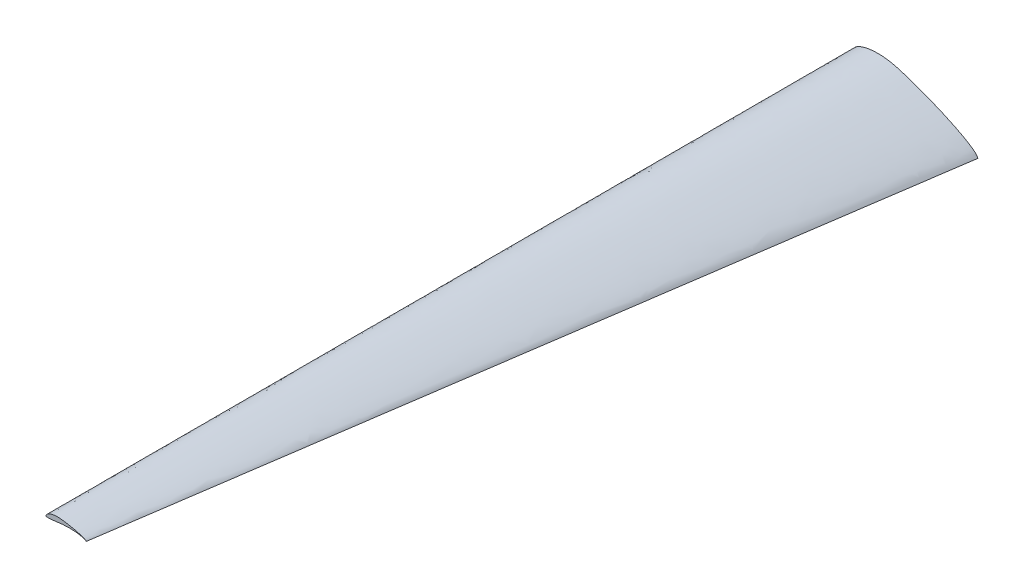
ISO-10303-21;
HEADER;
FILE_DESCRIPTION(('STEP AP214'),'2;1');
FILE_NAME('part.step','',(''),(''),'','','');
FILE_SCHEMA(('AUTOMOTIVE_DESIGN { 1 0 10303 214 1 1 1 1 }'));
ENDSEC;
DATA;
#1=APPLICATION_CONTEXT('core data for automotive mechanical design processes');
#2=APPLICATION_PROTOCOL_DEFINITION('international standard','automotive_design',2000,#1);
#3=PRODUCT_CONTEXT('',#1,'mechanical');
#4=PRODUCT('Part','Part','',(#3));
#5=PRODUCT_RELATED_PRODUCT_CATEGORY('part','',(#4));
#6=PRODUCT_DEFINITION_FORMATION('','',#4);
#7=PRODUCT_DEFINITION_CONTEXT('part definition',#1,'design');
#8=PRODUCT_DEFINITION('design','',#6,#7);
#9=PRODUCT_DEFINITION_SHAPE('','',#8);
#10=(LENGTH_UNIT() NAMED_UNIT(*) SI_UNIT(.MILLI.,.METRE.));
#11=(NAMED_UNIT(*) PLANE_ANGLE_UNIT() SI_UNIT($,.RADIAN.));
#12=(NAMED_UNIT(*) SI_UNIT($,.STERADIAN.) SOLID_ANGLE_UNIT());
#13=UNCERTAINTY_MEASURE_WITH_UNIT(LENGTH_MEASURE(1.E-05),#10,'distance_accuracy_value','');
#14=(GEOMETRIC_REPRESENTATION_CONTEXT(3) GLOBAL_UNCERTAINTY_ASSIGNED_CONTEXT((#13)) GLOBAL_UNIT_ASSIGNED_CONTEXT((#10,
#11,#12)) REPRESENTATION_CONTEXT('',''));
#15=CARTESIAN_POINT('',(0.,0.,0.));
#16=DIRECTION('',(0.,0.,1.));
#17=DIRECTION('',(1.,0.,0.));
#18=AXIS2_PLACEMENT_3D('',#15,#16,#17);
#19=CARTESIAN_POINT('',(0.177852621715534,0.538129016044614,500.));
#20=DIRECTION('',(0.,0.,-1.));
#21=DIRECTION('',(-1.,0.,0.));
#22=AXIS2_PLACEMENT_3D('',#19,#20,#21);
#23=PLANE('',#22);
#24=CARTESIAN_POINT('',(24.9657383688643,-1.3083989060736,500.));
#25=CARTESIAN_POINT('',(24.9659211372202,-1.30777118127219,500.));
#26=CARTESIAN_POINT('',(24.8870542598549,-1.24232109422479,500.));
#27=CARTESIAN_POINT('',(24.8212136304394,-1.17058048788677,500.));
#28=CARTESIAN_POINT('',(24.6745507578072,-1.02025700472763,500.));
#29=CARTESIAN_POINT('',(24.5006584165327,-0.859404979004517,500.));
#30=CARTESIAN_POINT('',(24.2599352106827,-0.693819703288479,500.));
#31=CARTESIAN_POINT('',(23.9584003357237,-0.529772184511535,500.));
#32=CARTESIAN_POINT('',(23.593109110757,-0.355916734630595,500.));
#33=CARTESIAN_POINT('',(23.1645180838336,-0.174431492549931,500.));
#34=CARTESIAN_POINT('',(22.6746068217033,0.0134564123888329,500.));
#35=CARTESIAN_POINT('',(22.1258890279423,0.206206849313119,500.));
#36=CARTESIAN_POINT('',(21.521445136275,0.402888673491008,500.));
#37=CARTESIAN_POINT('',(20.8645810585354,0.601813575142887,500.));
#38=CARTESIAN_POINT('',(20.1590498227737,0.801594057960295,500.));
#39=CARTESIAN_POINT('',(19.4090541376922,1.00099298738928,500.));
#40=CARTESIAN_POINT('',(18.6191819049756,1.19894691967824,500.));
#41=CARTESIAN_POINT('',(17.7939967063085,1.39329014310558,500.));
#42=CARTESIAN_POINT('',(16.9387333342498,1.58353243934119,500.));
#43=CARTESIAN_POINT('',(16.0582666727305,1.76754576650402,500.));
#44=CARTESIAN_POINT('',(15.1583513921923,1.94529775329526,500.));
#45=CARTESIAN_POINT('',(14.244744530525,2.11545183008815,500.));
#46=CARTESIAN_POINT('',(13.3240891838512,2.27726857695868,500.));
#47=CARTESIAN_POINT('',(12.4038347697921,2.43116170413698,500.));
#48=CARTESIAN_POINT('',(11.4915059957344,2.5740706667036,500.));
#49=CARTESIAN_POINT('',(10.594482933963,2.70382886476003,500.));
#50=CARTESIAN_POINT('',(9.71886150927105,2.81545935943417,500.));
#51=CARTESIAN_POINT('',(8.86947958557527,2.90519503304747,500.));
#52=CARTESIAN_POINT('',(8.05080533510073,2.96762866299189,500.));
#53=CARTESIAN_POINT('',(7.26725145264953,3.00661427614277,500.));
#54=CARTESIAN_POINT('',(6.5195069543389,3.00733677714258,500.));
#55=CARTESIAN_POINT('',(5.80712113746472,2.96672348744111,500.));
#56=CARTESIAN_POINT('',(5.12758750811802,2.8921169223932,500.));
#57=CARTESIAN_POINT('',(4.4807279124901,2.78322912011695,500.));
#58=CARTESIAN_POINT('',(3.86761306413132,2.64792193483418,500.));
#59=CARTESIAN_POINT('',(3.29095509584032,2.4890188338026,500.));
#60=CARTESIAN_POINT('',(2.75339559124329,2.31080405990054,500.));
#61=CARTESIAN_POINT('',(2.25826576945357,2.11420877745291,500.));
#62=CARTESIAN_POINT('',(1.80735233248289,1.90365763150733,500.));
#63=CARTESIAN_POINT('',(1.40318099666617,1.68168136248214,500.));
#64=CARTESIAN_POINT('',(1.0483788768604,1.45143729079899,500.));
#65=CARTESIAN_POINT('',(0.743362662237422,1.21817801107076,500.));
#66=CARTESIAN_POINT('',(0.492224520805339,0.978968370812016,500.));
#67=CARTESIAN_POINT('',(0.296210809495167,0.735928591518345,500.));
#68=CARTESIAN_POINT('',(0.148319907771107,0.497239973055056,500.));
#69=CARTESIAN_POINT('',(0.0495632708762007,0.268433195025406,500.));
#70=CARTESIAN_POINT('',(-0.00295447543302444,0.05521985454275,500.));
#71=CARTESIAN_POINT('',(-0.00454224338709244,-0.127352708842962,500.));
#72=CARTESIAN_POINT('',(0.0335988390782578,-0.296876376117312,500.));
#73=CARTESIAN_POINT('',(0.20357482435812,-0.388944967016245,500.));
#74=CARTESIAN_POINT('',(0.437343679026152,-0.412863433585569,500.));
#75=CARTESIAN_POINT('',(0.757381774317641,-0.440943776831186,500.));
#76=CARTESIAN_POINT('',(1.16150672197409,-0.444687890117561,500.));
#77=CARTESIAN_POINT('',(1.64442251613404,-0.437955891039795,500.));
#78=CARTESIAN_POINT('',(2.20101783680406,-0.415803813028377,500.));
#79=CARTESIAN_POINT('',(2.82556385718351,-0.37909400669089,500.));
#80=CARTESIAN_POINT('',(3.5151107017385,-0.326181799662972,500.));
#81=CARTESIAN_POINT('',(4.27014953231806,-0.241291326208084,500.));
#82=CARTESIAN_POINT('',(5.0941263116922,-0.128402818033724,500.));
#83=CARTESIAN_POINT('',(5.99018788371201,-0.00550803553789022,500.));
#84=CARTESIAN_POINT('',(6.95377320957862,0.123335526653627,500.));
#85=CARTESIAN_POINT('',(7.97849978123819,0.25101840908407,500.));
#86=CARTESIAN_POINT('',(9.05655581742164,0.371142786250566,500.));
#87=CARTESIAN_POINT('',(10.1793410504439,0.478261478263609,500.));
#88=CARTESIAN_POINT('',(11.3369359319311,0.56680628651204,500.));
#89=CARTESIAN_POINT('',(12.5187735927189,0.632986310006307,500.));
#90=CARTESIAN_POINT('',(13.7134526927182,0.671647448405974,500.));
#91=CARTESIAN_POINT('',(14.9088996464722,0.680785817423143,500.));
#92=CARTESIAN_POINT('',(16.0925158639482,0.658221558632512,500.));
#93=CARTESIAN_POINT('',(17.2513707297604,0.602473442589587,500.));
#94=CARTESIAN_POINT('',(18.3725206076361,0.513881116253294,500.));
#95=CARTESIAN_POINT('',(19.4431463161613,0.393814855834348,500.));
#96=CARTESIAN_POINT('',(20.4503766670958,0.243774431119053,500.));
#97=CARTESIAN_POINT('',(21.3823545713743,0.0681143188725926,500.));
#98=CARTESIAN_POINT('',(22.227052000337,-0.128855360923447,500.));
#99=CARTESIAN_POINT('',(22.9747389661672,-0.341510536716519,500.));
#100=CARTESIAN_POINT('',(23.6119193155118,-0.560524973609317,500.));
#101=CARTESIAN_POINT('',(24.1309711554189,-0.785838329034471,500.));
#102=CARTESIAN_POINT('',(24.4992133348935,-0.986434013196571,500.));
#103=CARTESIAN_POINT('',(24.76893316005,-1.16820266072511,500.));
#104=CARTESIAN_POINT('',(24.8725231548848,-1.23850287715182,500.));
#105=CARTESIAN_POINT('',(24.9655518848444,-1.30903939246347,500.));
#106=CARTESIAN_POINT('',(24.9657383688643,-1.3083989060736,500.));
#107=B_SPLINE_CURVE_WITH_KNOTS('',3,(#24,#25,#26,#27,#28,#29,#30,#31,#32,#33,#34,#35,#36,#37,
#38,#39,#40,#41,#42,#43,#44,#45,#46,#47,#48,#49,#50,#51,#52,#53,#54,#55,#56,#57,#58,#59,#60,#61,
#62,#63,#64,#65,#66,#67,#68,#69,#70,#71,#72,#73,#74,#75,#76,#77,#78,#79,#80,#81,#82,#83,#84,#85,
#86,#87,#88,#89,#90,#91,#92,#93,#94,#95,#96,#97,#98,#99,#100,#101,#102,#103,#104,#105,#106),
.UNSPECIFIED.,.T.,.F.,(4,1,1,1,1,1,1,1,1,1,1,1,1,1,1,1,1,1,1,1,1,1,1,1,1,1,1,1,1,1,1,1,1,1,1,1,
1,1,1,1,1,1,1,1,1,1,1,1,1,1,1,1,1,1,1,1,1,1,1,1,1,1,1,1,1,1,1,1,1,1,1,1,1,1,1,1,1,1,1,1,4),(0.,
0.000979677557134127,0.0036488621677631,0.00748349851947818,0.0120952771855934,
0.0175255907768788,0.0240517799938711,0.0317830505527586,0.0406778280832618,0.050710300790478,
0.0618332290621795,0.0739892504845854,0.0871181731906812,0.101145048769791,0.115990637111827,
0.13157042164059,0.147788379302961,0.164550916882416,0.181757895150531,0.199311954944345,
0.217095071712265,0.234990228463986,0.252856883122009,0.270540593729572,0.287886779266045,
0.304773437599674,0.321101419214061,0.336806063174811,0.351800032584037,0.366031063392082,
0.379615674919835,0.392652962879187,0.405170358707495,0.417171919049936,0.428603516911185,
0.43941895910826,0.449596586064162,0.459102079103161,0.467907877534646,0.475988300736528,
0.48330896874615,0.489874507816402,0.495803249719208,0.501149411695553,0.505903073256041,
0.510046768536664,0.513579310681042,0.516446926626751,0.519350052590901,0.523823355179486,
0.529973793997694,0.537715654387928,0.546967844488147,0.557637366825711,0.569620481096633,
0.582804124215616,0.597246960791633,0.613135036654701,0.630443600329816,0.649056123608546,
0.668822256795696,0.689594964002685,0.711189650864602,0.733426688964389,0.756094117504156,
0.778988553684862,0.801889682684955,0.824566597829707,0.846792284880412,0.868338290507787,
0.888978162959066,0.908492011340558,0.926658767581933,0.943286193042322,0.958169210358795,
0.971135821634751,0.981955623079976,0.990251791025976,0.995852565249962,0.999000405686701,1.),.UNSPECIFIED.);
#108=CARTESIAN_POINT('',(24.9657383688643,-1.3083989060736,500.));
#109=VERTEX_POINT('',#108);
#110=EDGE_CURVE('E11',#109,#109,#107,.T.);
#111=ORIENTED_EDGE('',*,*,#110,.T.);
#112=EDGE_LOOP('',(#111));
#113=FACE_BOUND('',#112,.T.);
#114=ADVANCED_FACE('F45',(#113),#23,.F.);
#115=CARTESIAN_POINT('',(0.8872474401851,1.58177980888547,0.));
#116=DIRECTION('',(0.,0.,-1.));
#117=DIRECTION('',(-1.,0.,0.));
#118=AXIS2_PLACEMENT_3D('',#115,#116,#117);
#119=PLANE('',#118);
#120=CARTESIAN_POINT('',(77.6236581020797,-19.3537516479734,0.));
#121=CARTESIAN_POINT('',(77.6246154970399,-19.3518914307497,0.));
#122=CARTESIAN_POINT('',(77.4168413999566,-19.0981439291712,0.));
#123=CARTESIAN_POINT('',(77.2538263644798,-18.8325902853563,0.));
#124=CARTESIAN_POINT('',(76.8849137571991,-18.2708424045065,0.));
#125=CARTESIAN_POINT('',(76.4368963627804,-17.6593961840115,0.));
#126=CARTESIAN_POINT('',(75.7818394589706,-16.992275669152,0.));
#127=CARTESIAN_POINT('',(74.9348215781215,-16.2928546439664,0.));
#128=CARTESIAN_POINT('',(73.8935204178983,-15.5236959647682,0.));
#129=CARTESIAN_POINT('',(72.6580401430418,-14.6919203798223,0.));
#130=CARTESIAN_POINT('',(71.2338497110435,-13.8025912576474,0.));
#131=CARTESIAN_POINT('',(69.6279047985015,-12.8620813073143,0.));
#132=CARTESIAN_POINT('',(67.8493131388238,-11.8751963254468,0.));
#133=CARTESIAN_POINT('',(65.9074284223442,-10.8492581952114,0.));
#134=CARTESIAN_POINT('',(63.813192497311,-9.79091688654471,0.));
#135=CARTESIAN_POINT('',(61.5790515611801,-8.70662462195275,0.));
#136=CARTESIAN_POINT('',(59.2187678359504,-7.60252321969453,0.));
#137=CARTESIAN_POINT('',(56.7453541170068,-6.48820210035888,0.));
#138=CARTESIAN_POINT('',(54.1749546494961,-5.36839744681885,0.));
#139=CARTESIAN_POINT('',(51.5215830943764,-4.25277042855736,0.));
#140=CARTESIAN_POINT('',(48.8032962970951,-3.14493646775866,0.));
#141=CARTESIAN_POINT('',(46.0373622108717,-2.05260918904444,0.));
#142=CARTESIAN_POINT('',(43.2441966941485,-0.982167463437832,0.));
#143=CARTESIAN_POINT('',(40.4474525164337,0.0631397276707607,0.));
#144=CARTESIAN_POINT('',(37.6688976067412,1.06910407725404,0.));
#145=CARTESIAN_POINT('',(34.9303913980974,2.02441365720142,0.));
#146=CARTESIAN_POINT('',(32.2480435889945,2.90971276903982,0.));
#147=CARTESIAN_POINT('',(29.6347507515633,3.71021417094443,0.));
#148=CARTESIAN_POINT('',(27.1012467501327,4.40620444162746,0.));
#149=CARTESIAN_POINT('',(24.6637459980348,5.00709553527926,0.));
#150=CARTESIAN_POINT('',(22.3153669064341,5.46592946533518,0.));
#151=CARTESIAN_POINT('',(20.0528175817841,5.77332950648099,0.));
#152=CARTESIAN_POINT('',(17.8727078654357,5.95389045632268,0.));
#153=CARTESIAN_POINT('',(15.7743023131048,6.00681654570254,0.));
#154=CARTESIAN_POINT('',(13.7657646176955,5.95614972034708,0.));
#155=CARTESIAN_POINT('',(11.8573381271477,5.80910307746313,0.));
#156=CARTESIAN_POINT('',(10.0599365130593,5.5775213893768,0.));
#157=CARTESIAN_POINT('',(8.38459238267852,5.26229563094,0.));
#158=CARTESIAN_POINT('',(6.83961977549295,4.87623358788055,0.));
#159=CARTESIAN_POINT('',(5.43449773101881,4.42574266561422,0.));
#160=CARTESIAN_POINT('',(4.17940638524131,3.91913657424063,0.));
#161=CARTESIAN_POINT('',(3.07886182046236,3.37266037492258,0.));
#162=CARTESIAN_POINT('',(2.14392621223064,2.77459551427193,0.));
#163=CARTESIAN_POINT('',(1.37980920911355,2.1308410353002,0.));
#164=CARTESIAN_POINT('',(0.769512681709647,1.47137120528474,0.));
#165=CARTESIAN_POINT('',(0.319590791235752,0.812941450410188,0.));
#166=CARTESIAN_POINT('',(0.0244360050312191,0.175260962478174,0.));
#167=CARTESIAN_POINT('',(-0.0920282624493205,-0.397267775963202,0.));
#168=CARTESIAN_POINT('',(-0.0757284777807108,-0.953065221281685,0.));
#169=CARTESIAN_POINT('',(0.40198522573562,-1.3460571526657,0.));
#170=CARTESIAN_POINT('',(1.1216972379229,-1.56392664796287,0.));
#171=CARTESIAN_POINT('',(2.10985759629863,-1.84754449018761,0.));
#172=CARTESIAN_POINT('',(3.37701159192801,-2.10605968586357,0.));
#173=CARTESIAN_POINT('',(4.89806054183052,-2.3797760514362,0.));
#174=CARTESIAN_POINT('',(6.65996746247156,-2.65004264990811,0.));
#175=CARTESIAN_POINT('',(8.64421038146753,-2.91607034563625,0.));
#176=CARTESIAN_POINT('',(10.8425273476816,-3.17089172137958,0.));
#177=CARTESIAN_POINT('',(13.2660937688413,-3.36525141537672,0.));
#178=CARTESIAN_POINT('',(15.9233038424337,-3.51375622549889,0.));
#179=CARTESIAN_POINT('',(18.8130568892258,-3.67484342278154,0.));
#180=CARTESIAN_POINT('',(21.91854828156,-3.85847351855359,0.));
#181=CARTESIAN_POINT('',(25.2153882843296,-4.08308170869547,0.));
#182=CARTESIAN_POINT('',(28.6751320351292,-4.36399510134325,0.));
#183=CARTESIAN_POINT('',(32.2674383260645,-4.71307318902718,0.));
#184=CARTESIAN_POINT('',(35.9577479228499,-5.14175007113851,0.));
#185=CARTESIAN_POINT('',(39.710553420605,-5.65548174054623,0.));
#186=CARTESIAN_POINT('',(43.4868938143146,-6.26349676285687,0.));
#187=CARTESIAN_POINT('',(47.2476199237104,-6.96471775751968,0.));
#188=CARTESIAN_POINT('',(50.951825972647,-7.75829955326755,0.));
#189=CARTESIAN_POINT('',(54.5579897996409,-8.64099970964061,0.));
#190=CARTESIAN_POINT('',(58.0256601486183,-9.60384808609039,0.));
#191=CARTESIAN_POINT('',(61.3154059926412,-10.6347131130029,0.));
#192=CARTESIAN_POINT('',(64.3877120078894,-11.7210246998545,0.));
#193=CARTESIAN_POINT('',(67.2079914180233,-12.8418647281973,0.));
#194=CARTESIAN_POINT('',(69.7410934063006,-13.9763500396223,0.));
#195=CARTESIAN_POINT('',(71.9598880620242,-15.1008732398319,0.));
#196=CARTESIAN_POINT('',(73.8276756684207,-16.1778980947233,0.));
#197=CARTESIAN_POINT('',(75.3205511265895,-17.2025812134438,0.));
#198=CARTESIAN_POINT('',(76.3547945585653,-18.057538323129,0.));
#199=CARTESIAN_POINT('',(77.0910544602052,-18.7931991691571,0.));
#200=CARTESIAN_POINT('',(77.3735275520195,-19.0772775892922,0.));
#201=CARTESIAN_POINT('',(77.6226812433665,-19.3556496832452,0.));
#202=CARTESIAN_POINT('',(77.6236581020797,-19.3537516479734,0.));
#203=B_SPLINE_CURVE_WITH_KNOTS('',3,(#120,#121,#122,#123,#124,#125,#126,#127,#128,#129,#130,
#131,#132,#133,#134,#135,#136,#137,#138,#139,#140,#141,#142,#143,#144,#145,#146,#147,#148,#149,
#150,#151,#152,#153,#154,#155,#156,#157,#158,#159,#160,#161,#162,#163,#164,#165,#166,#167,#168,
#169,#170,#171,#172,#173,#174,#175,#176,#177,#178,#179,#180,#181,#182,#183,#184,#185,#186,#187,
#188,#189,#190,#191,#192,#193,#194,#195,#196,#197,#198,#199,#200,#201,#202),.UNSPECIFIED.,.T.,
.F.,(4,1,1,1,1,1,1,1,1,1,1,1,1,1,1,1,1,1,1,1,1,1,1,1,1,1,1,1,1,1,1,1,1,1,1,1,1,1,1,1,1,1,1,1,1,
1,1,1,1,1,1,1,1,1,1,1,1,1,1,1,1,1,1,1,1,1,1,1,1,1,1,1,1,1,1,1,1,1,1,1,4),(0.,
0.000979677557134127,0.0036488621677631,0.00748349851947818,0.0120952771855934,
0.0175255907768788,0.0240517799938711,0.0317830505527586,0.0406778280832618,0.050710300790478,
0.0618332290621795,0.0739892504845854,0.0871181731906812,0.101145048769791,0.115990637111827,
0.13157042164059,0.147788379302961,0.164550916882416,0.181757895150531,0.199311954944345,
0.217095071712265,0.234990228463986,0.252856883122009,0.270540593729572,0.287886779266045,
0.304773437599674,0.321101419214061,0.336806063174811,0.351800032584037,0.366031063392082,
0.379615674919835,0.392652962879187,0.405170358707495,0.417171919049936,0.428603516911185,
0.43941895910826,0.449596586064162,0.459102079103161,0.467907877534646,0.475988300736528,
0.48330896874615,0.489874507816402,0.495803249719208,0.501149411695553,0.505903073256041,
0.510046768536664,0.513579310681042,0.516446926626751,0.519350052590901,0.523823355179486,
0.529973793997694,0.537715654387928,0.546967844488147,0.557637366825711,0.569620481096633,
0.582804124215616,0.597246960791633,0.613135036654701,0.630443600329816,0.649056123608546,
0.668822256795696,0.689594964002685,0.711189650864602,0.733426688964389,0.756094117504156,
0.778988553684862,0.801889682684955,0.824566597829707,0.846792284880412,0.868338290507787,
0.888978162959066,0.908492011340558,0.926658767581933,0.943286193042322,0.958169210358795,
0.971135821634751,0.981955623079976,0.990251791025976,0.995852565249962,0.999000405686701,1.),.UNSPECIFIED.);
#204=CARTESIAN_POINT('',(77.6236581020797,-19.3537516479734,0.));
#205=VERTEX_POINT('',#204);
#206=EDGE_CURVE('E55',#205,#205,#203,.T.);
#207=ORIENTED_EDGE('',*,*,#206,.F.);
#208=EDGE_LOOP('',(#207));
#209=FACE_BOUND('',#208,.T.);
#210=ADVANCED_FACE('F76',(#209),#119,.T.);
#211=CARTESIAN_POINT('',(77.589556155821,-19.3091196529313,0.));
#212=CARTESIAN_POINT('',(24.9657383688643,-1.3083989060736,500.));
#213=CARTESIAN_POINT('',(77.5700822295334,-19.2846832392953,0.));
#214=CARTESIAN_POINT('',(24.9658278573661,-1.3080915544441,500.));
#215=CARTESIAN_POINT('',(77.5190171521002,-19.2211268160083,0.));
#216=CARTESIAN_POINT('',(24.9555533379956,-1.29916714641745,500.));
#217=CARTESIAN_POINT('',(77.3846091906055,-19.0456372348263,0.));
#218=CARTESIAN_POINT('',(24.8927986638957,-1.24614233982107,500.));
#219=CARTESIAN_POINT('',(77.3127951712541,-18.9295108077496,0.));
#220=CARTESIAN_POINT('',(24.8593502299914,-1.21213450703603,500.));
#221=CARTESIAN_POINT('',(77.1486451596768,-18.6724295379673,0.));
#222=CARTESIAN_POINT('',(24.7977248743884,-1.14669501429866,500.));
#223=CARTESIAN_POINT('',(77.0050158543288,-18.4550317314914,0.));
#224=CARTESIAN_POINT('',(24.7419972447112,-1.08938691236068,500.));
#225=CARTESIAN_POINT('',(76.7449677697231,-18.0798465945634,0.));
#226=CARTESIAN_POINT('',(24.6392299627494,-0.987984004053063,500.));
#227=CARTESIAN_POINT('',(76.5780857590675,-17.8555743946599,0.));
#228=CARTESIAN_POINT('',(24.5749724818659,-0.928146177500931,500.));
#229=CARTESIAN_POINT('',(76.2347929691881,-17.4535708286814,0.));
#230=CARTESIAN_POINT('',(24.4475923709114,-0.82378011881693,500.));
#231=CARTESIAN_POINT('',(75.9994628759365,-17.2159625463552,0.));
#232=CARTESIAN_POINT('',(24.3620198353334,-0.76404023171435,500.));
#233=CARTESIAN_POINT('',(75.5267023459555,-16.7815973999176,0.));
#234=CARTESIAN_POINT('',(24.1918500709666,-0.657392540045339,500.));
#235=CARTESIAN_POINT('',(75.2239364802894,-16.5325551145107,0.));
#236=CARTESIAN_POINT('',(24.0844691955786,-0.598358889969904,500.));
#237=CARTESIAN_POINT('',(74.6188098296115,-16.0594320872846,0.));
#238=CARTESIAN_POINT('',(23.8710759135758,-0.488512402152182,500.));
#239=CARTESIAN_POINT('',(74.2482592871183,-15.7864747755374,0.));
#240=CARTESIAN_POINT('',(23.7413379730621,-0.426464269802667,500.));
#241=CARTESIAN_POINT('',(73.5120449226381,-15.2668711415233,0.));
#242=CARTESIAN_POINT('',(23.4848054159067,-0.310289934361858,500.));
#243=CARTESIAN_POINT('',(73.0763867230646,-14.9741422595119,0.));
#244=CARTESIAN_POINT('',(23.3338494331602,-0.246134209111657,500.));
#245=CARTESIAN_POINT('',(72.2127864724687,-14.4138837864712,0.));
#246=CARTESIAN_POINT('',(23.0357457946893,-0.125224121221604,500.));
#247=CARTESIAN_POINT('',(71.7134099682588,-14.1025161098544,0.));
#248=CARTESIAN_POINT('',(22.864096659906,-0.0592156232616122,500.));
#249=CARTESIAN_POINT('',(70.7260788097736,-13.5052189247583,0.));
#250=CARTESIAN_POINT('',(22.5257741708655,0.0655931045897536,500.));
#251=CARTESIAN_POINT('',(70.1655767818801,-13.1773402980061,0.));
#252=CARTESIAN_POINT('',(22.3343635888313,0.132975102218625,500.));
#253=CARTESIAN_POINT('',(69.0601033330909,-12.5470260017038,0.));
#254=CARTESIAN_POINT('',(21.9577928204244,0.260788292486256,500.));
#255=CARTESIAN_POINT('',(68.4416969360096,-12.2042197979758,0.));
#256=CARTESIAN_POINT('',(21.7477126587127,0.329262800719738,500.));
#257=CARTESIAN_POINT('',(67.2241440478957,-11.5449064772469,0.));
#258=CARTESIAN_POINT('',(21.3350095026435,0.459247984182048,500.));
#259=CARTESIAN_POINT('',(66.5508001105512,-11.189452153672,0.));
#260=CARTESIAN_POINT('',(21.1073116878138,0.528304963249755,500.));
#261=CARTESIAN_POINT('',(65.2278751537096,-10.5058397259556,0.));
#262=CARTESIAN_POINT('',(20.6608180076598,0.659423831528019,500.));
#263=CARTESIAN_POINT('',(64.503448771413,-10.1399974799462,0.));
#264=CARTESIAN_POINT('',(20.4168220722705,0.728602442775747,500.));
#265=CARTESIAN_POINT('',(63.0830812305583,-9.43657308216398,0.));
#266=CARTESIAN_POINT('',(19.9392414546585,0.859956587612188,500.));
#267=CARTESIAN_POINT('',(62.3117353789036,-9.06244085631929,0.));
#268=CARTESIAN_POINT('',(19.6803513035499,0.928864086510002,500.));
#269=CARTESIAN_POINT('',(60.802521625918,-8.34337685590932,0.));
#270=CARTESIAN_POINT('',(19.1745722884914,1.0596896885522,500.));
#271=CARTESIAN_POINT('',(59.9887553281592,-7.96293287437315,0.));
#272=CARTESIAN_POINT('',(18.9022888444138,1.12799603724585,500.));
#273=CARTESIAN_POINT('',(58.3997453784692,-7.23353762921627,0.));
#274=CARTESIAN_POINT('',(18.3714120847885,1.25723312577568,500.));
#275=CARTESIAN_POINT('',(57.5481463960776,-6.8500686457874,0.));
#276=CARTESIAN_POINT('',(18.0873391371353,1.32420369600622,500.));
#277=CARTESIAN_POINT('',(55.8891279216758,-6.11518378544961,0.));
#278=CARTESIAN_POINT('',(17.5346491820403,1.45092049310251,500.));
#279=CARTESIAN_POINT('',(55.0049388293339,-5.73018218593809,0.));
#280=CARTESIAN_POINT('',(17.2404845261556,1.51641178210807,500.));
#281=CARTESIAN_POINT('',(53.2859649853171,-4.99461606426063,0.));
#282=CARTESIAN_POINT('',(16.6693610498648,1.63977025821153,500.));
#283=CARTESIAN_POINT('',(52.3740275254217,-4.61135621103855,0.));
#284=CARTESIAN_POINT('',(16.3667855898221,1.70306678631329,500.));
#285=CARTESIAN_POINT('',(50.60554123536,-3.879438857383,0.));
#286=CARTESIAN_POINT('',(15.7806824397049,1.82232350629702,500.));
#287=CARTESIAN_POINT('',(49.6714858708863,-3.49893350865801,0.));
#288=CARTESIAN_POINT('',(15.471483389782,1.88344767040058,500.));
#289=CARTESIAN_POINT('',(47.8652134385131,-2.77446722873117,0.));
#290=CARTESIAN_POINT('',(14.8742309236843,1.99816361106158,500.));
#291=CARTESIAN_POINT('',(46.9151762719774,-2.39943316198269,0.));
#292=CARTESIAN_POINT('',(14.5604538070506,2.05665277467811,500.));
#293=CARTESIAN_POINT('',(45.0836253573936,-1.68710284253569,0.));
#294=CARTESIAN_POINT('',(13.9561663085089,2.16612670379312,500.));
#295=CARTESIAN_POINT('',(44.1240017751513,-1.31946804124708,0.));
#296=CARTESIAN_POINT('',(13.6398867653462,2.22176318344556,500.));
#297=CARTESIAN_POINT('',(42.2815987883333,-0.622388216872323,0.));
#298=CARTESIAN_POINT('',(13.0331727904033,2.32588052481589,500.));
#299=CARTESIAN_POINT('',(41.3204409041443,-0.263306120648175,0.));
#300=CARTESIAN_POINT('',(12.7169319073515,2.37880281634088,500.));
#301=CARTESIAN_POINT('',(39.4826871824706,0.412429039282064,0.));
#302=CARTESIAN_POINT('',(12.1129211922209,2.47668435525907,500.));
#303=CARTESIAN_POINT('',(38.5274744154996,0.758079132770716,0.));
#304=CARTESIAN_POINT('',(11.7993065674834,2.52585618346372,500.));
#305=CARTESIAN_POINT('',(36.7097391086283,1.40370010593675,0.));
#306=CARTESIAN_POINT('',(11.2032341713241,2.61571774443947,500.));
#307=CARTESIAN_POINT('',(35.7683053048772,1.73185306075719,0.));
#308=CARTESIAN_POINT('',(10.8948925751172,2.66037333348533,500.));
#309=CARTESIAN_POINT('',(33.9836173642404,2.33689297417919,0.));
#310=CARTESIAN_POINT('',(10.3113866075335,2.73984468866544,500.));
#311=CARTESIAN_POINT('',(33.0611256453055,2.64102625025643,0.));
#312=CARTESIAN_POINT('',(10.0102915067578,2.77830577471715,500.));
#313=CARTESIAN_POINT('',(31.3192395247581,3.19422315565488,0.));
#314=CARTESIAN_POINT('',(9.44301129547839,2.84450662962756,500.));
#315=CARTESIAN_POINT('',(30.4201611713599,3.46918075387322,0.));
#316=CARTESIAN_POINT('',(9.15083962538311,2.87546985054045,500.));
#317=CARTESIAN_POINT('',(28.7281624945705,3.95926710554654,0.));
#318=CARTESIAN_POINT('',(8.60262699036145,2.9254166530944,500.));
#319=CARTESIAN_POINT('',(27.8550561674932,4.19871835183458,0.));
#320=CARTESIAN_POINT('',(8.32053598016796,2.94705849937793,500.));
#321=CARTESIAN_POINT('',(26.2221204497428,4.62292608310582,0.));
#322=CARTESIAN_POINT('',(7.79435482104965,2.9802718714721,500.));
#323=CARTESIAN_POINT('',(25.3813889789047,4.8294390676992,0.));
#324=CARTESIAN_POINT('',(7.52415436386714,2.99383210794939,500.));
#325=CARTESIAN_POINT('',(23.8138033719563,5.17316008458498,0.));
#326=CARTESIAN_POINT('',(7.02281553455521,3.00663602138348,500.));
#327=CARTESIAN_POINT('',(23.0055733734502,5.33020182857374,0.));
#328=CARTESIAN_POINT('',(6.76551924826658,3.00709907010665,500.));
#329=CARTESIAN_POINT('',(21.4995212966823,5.57677388816125,0.));
#330=CARTESIAN_POINT('',(6.28879401903112,2.99392739302967,500.));
#331=CARTESIAN_POINT('',(20.719391935427,5.68198417699055,0.));
#332=CARTESIAN_POINT('',(6.0431818527675,2.98018136657155,500.));
#333=CARTESIAN_POINT('',(19.2682863781664,5.83830591488988,0.));
#334=CARTESIAN_POINT('',(5.58864731203293,2.94250305652022,500.));
#335=CARTESIAN_POINT('',(18.514196152596,5.89990870905007,0.));
#336=CARTESIAN_POINT('',(5.35359459809681,2.91693042967466,500.));
#337=CARTESIAN_POINT('',(17.1163297745341,5.97296786221286,0.));
#338=CARTESIAN_POINT('',(4.92029538628715,2.85696394710736,500.));
#339=CARTESIAN_POINT('',(16.3890010926711,5.99056439817075,0.));
#340=CARTESIAN_POINT('',(4.69605174108491,2.81947522148403,500.));
#341=CARTESIAN_POINT('',(15.047027562004,5.98847051073208,0.));
#342=CARTESIAN_POINT('',(4.28434890430247,2.739660709095,500.));
#343=CARTESIAN_POINT('',(14.348611385958,5.9700821192227,0.));
#344=CARTESIAN_POINT('',(4.07109921381524,2.69282891797357,500.));
#345=CARTESIAN_POINT('',(13.0691431888214,5.90247416984288,0.));
#346=CARTESIAN_POINT('',(3.68243044401712,2.59665501978845,500.));
#347=CARTESIAN_POINT('',(12.4043593019984,5.85048186306956,0.));
#348=CARTESIAN_POINT('',(3.48147791535963,2.54151904797396,500.));
#349=CARTESIAN_POINT('',(11.1959320050289,5.7238858699841,0.));
#350=CARTESIAN_POINT('',(3.11807833660232,2.43146610104092,500.));
#351=CARTESIAN_POINT('',(10.5688164248567,5.64220864374673,0.));
#352=CARTESIAN_POINT('',(2.93041698853555,2.36949119690487,500.));
#353=CARTESIAN_POINT('',(9.43835771326215,5.46056771696935,0.));
#354=CARTESIAN_POINT('',(2.59413403335397,2.24729167922318,500.));
#355=CARTESIAN_POINT('',(8.85200552669827,5.3493341692523,0.));
#356=CARTESIAN_POINT('',(2.42070024615626,2.1787046943241,500.));
#357=CARTESIAN_POINT('',(7.80553771574384,5.11759984363595,0.));
#358=CARTESIAN_POINT('',(2.11310864956784,2.04614022412178,500.));
#359=CARTESIAN_POINT('',(7.26320367941724,4.98105118366148,0.));
#360=CARTESIAN_POINT('',(1.95464151685317,1.97243337428159,500.));
#361=CARTESIAN_POINT('',(6.30691703062435,4.70544575363269,0.));
#362=CARTESIAN_POINT('',(1.67722687788265,1.83186012918482,500.));
#363=CARTESIAN_POINT('',(5.81185044490377,4.54553802986406,0.));
#364=CARTESIAN_POINT('',(1.53458439936734,1.75384985758306,500.));
#365=CARTESIAN_POINT('',(4.95200587598826,4.23098926091665,0.));
#366=CARTESIAN_POINT('',(1.2889378347387,1.60715678848077,500.));
#367=CARTESIAN_POINT('',(4.507610520153,4.0503164761989,0.));
#368=CARTESIAN_POINT('',(1.16300696961721,1.52582365247025,500.));
#369=CARTESIAN_POINT('',(3.74952078115646,3.70567656673151,0.));
#370=CARTESIAN_POINT('',(0.950260040184446,1.37597054365516,500.));
#371=CARTESIAN_POINT('',(3.35852101405583,3.50962355125342,0.));
#372=CARTESIAN_POINT('',(0.84147074511683,1.29320556583946,500.));
#373=CARTESIAN_POINT('',(2.70985652969522,3.13661299812045,0.));
#374=CARTESIAN_POINT('',(0.663561561399431,1.14150401424852,500.));
#375=CARTESIAN_POINT('',(2.37771149067899,2.92168865545646,0.));
#376=CARTESIAN_POINT('',(0.573703524204296,1.05657730341207,500.));
#377=CARTESIAN_POINT('',(1.84130488371006,2.51964262764229,0.));
#378=CARTESIAN_POINT('',(0.431509748919238,0.902750244692598,500.));
#379=CARTESIAN_POINT('',(1.56731358592033,2.28622553575821,0.));
#380=CARTESIAN_POINT('',(0.360442841790737,0.815570667821858,500.));
#381=CARTESIAN_POINT('',(1.13503129188789,1.86634067487538,0.));
#382=CARTESIAN_POINT('',(0.251191121011611,0.662203604978581,500.));
#383=CARTESIAN_POINT('',(0.914313099046398,1.62433846056879,0.));
#384=CARTESIAN_POINT('',(0.196793911873951,0.5754746239755,500.));
#385=CARTESIAN_POINT('',(0.584845094561315,1.20112288726829,0.));
#386=CARTESIAN_POINT('',(0.118782486099414,0.427118621589412,500.));
#387=CARTESIAN_POINT('',(0.421208645210169,0.956765378221853,0.));
#388=CARTESIAN_POINT('',(0.0817600710811223,0.343029154845221,500.));
#389=CARTESIAN_POINT('',(0.194839708448872,0.543417339469774,0.));
#390=CARTESIAN_POINT('',(0.0344103847202297,0.203761373243001,500.));
#391=CARTESIAN_POINT('',(0.0884139599372809,0.304279111835336,0.));
#392=CARTESIAN_POINT('',(0.0140834768501311,0.12439111524168,500.));
#393=CARTESIAN_POINT('',(-0.0268568716153943,-0.0768905908935214,0.));
#394=CARTESIAN_POINT('',(-0.00235764367140643,0.000742433756245641,500.));
#395=CARTESIAN_POINT('',(-0.0673673991195018,-0.297571188705904,0.));
#396=CARTESIAN_POINT('',(-0.00403512397764069,-0.0690406045527603,500.));
#397=CARTESIAN_POINT('',(-0.0849630617754419,-0.638180190761322,0.));
#398=CARTESIAN_POINT('',(0.0069587440799328,-0.173738936641277,500.));
#399=CARTESIAN_POINT('',(-0.0659672246611726,-0.833130465744622,0.));
#400=CARTESIAN_POINT('',(0.0196468939769272,-0.234864898038874,500.));
#401=CARTESIAN_POINT('',(0.0813146012542304,-1.08225695785142,0.));
#402=CARTESIAN_POINT('',(0.0682712288557247,-0.310938761724825,500.));
#403=CARTESIAN_POINT('',(0.241529815712007,-1.20767692061808,0.));
#404=CARTESIAN_POINT('',(0.121054486881066,-0.344247292933006,500.));
#405=CARTESIAN_POINT('',(0.583052325367023,-1.40086935107785,0.));
#406=CARTESIAN_POINT('',(0.236696618966852,-0.38987642730224,500.));
#407=CARTESIAN_POINT('',(0.847802585765041,-1.48081617129453,0.));
#408=CARTESIAN_POINT('',(0.322412008220681,-0.401103999978295,500.));
#409=CARTESIAN_POINT('',(1.38928555501604,-1.64072877876606,0.));
#410=CARTESIAN_POINT('',(0.497914396791287,-0.41809910140813,500.));
#411=CARTESIAN_POINT('',(1.74733824281935,-1.74240789325664,0.));
#412=CARTESIAN_POINT('',(0.613759510641124,-0.428342269319788,500.));
#413=CARTESIAN_POINT('',(2.47396716987198,-1.9218273776539,0.));
#414=CARTESIAN_POINT('',(0.847323751956326,-0.441371413791047,500.));
#415=CARTESIAN_POINT('',(2.92526337850042,-2.01357662738789,0.));
#416=CARTESIAN_POINT('',(0.991224143477032,-0.443110265998371,500.));
#417=CARTESIAN_POINT('',(3.83018057279798,-2.18760851862265,0.));
#418=CARTESIAN_POINT('',(1.27919641437601,-0.442930999699282,500.));
#419=CARTESIAN_POINT('',(4.36645199947935,-2.2837528558526,0.));
#420=CARTESIAN_POINT('',(1.44943907028723,-0.440674022013133,500.));
#421=CARTESIAN_POINT('',(5.43661388994758,-2.46238710187597,0.));
#422=CARTESIAN_POINT('',(1.78838285804377,-0.432099829995405,500.));
#423=CARTESIAN_POINT('',(6.0534737145527,-2.55674613360267,0.));
#424=CARTESIAN_POINT('',(1.98324379718609,-0.424471057137925,500.));
#425=CARTESIAN_POINT('',(7.2784202090608,-2.73295868680904,0.));
#426=CARTESIAN_POINT('',(2.36953104881239,-0.405807649436316,500.));
#427=CARTESIAN_POINT('',(7.96963833146506,-2.82538051497765,0.));
#428=CARTESIAN_POINT('',(2.58708863249649,-0.393111195222858,500.));
#429=CARTESIAN_POINT('',(9.33701833947481,-2.996378271972,0.));
#430=CARTESIAN_POINT('',(3.01675908333615,-0.364337612670759,500.));
#431=CARTESIAN_POINT('',(10.0965037006422,-3.08392250814434,0.));
#432=CARTESIAN_POINT('',(3.25497711327372,-0.346143086407235,500.));
#433=CARTESIAN_POINT('',(11.6046451627233,-3.23201032082378,0.));
#434=CARTESIAN_POINT('',(3.72649860849752,-0.30224698515548,500.));
#435=CARTESIAN_POINT('',(12.43691461659,-3.29842079521744,0.));
#436=CARTESIAN_POINT('',(3.98579333280497,-0.273262042718081,500.));
#437=CARTESIAN_POINT('',(14.0995675838537,-3.41183217760938,0.));
#438=CARTESIAN_POINT('',(4.50264313122834,-0.209323476761318,500.));
#439=CARTESIAN_POINT('',(15.0136530579474,-3.46291615166777,0.));
#440=CARTESIAN_POINT('',(4.78610774921584,-0.170602740262575,500.));
#441=CARTESIAN_POINT('',(16.8373794539254,-3.56471071052766,0.));
#442=CARTESIAN_POINT('',(5.35162175590152,-0.0930866609063811,500.));
#443=CARTESIAN_POINT('',(17.8306829059664,-3.6201285081624,0.));
#444=CARTESIAN_POINT('',(5.6596286402997,-0.0508442128605865,500.));
#445=CARTESIAN_POINT('',(19.8061813635887,-3.73356763718155,0.));
#446=CARTESIAN_POINT('',(6.27238571283232,0.0322095728438522,500.));
#447=CARTESIAN_POINT('',(20.8720156108374,-3.79671610578511,0.));
#448=CARTESIAN_POINT('',(6.6030976235007,0.0764457593740747,500.));
#449=CARTESIAN_POINT('',(22.9837972871071,-3.9310471499659,0.));
#450=CARTESIAN_POINT('',(7.25889444634436,0.161312590185981,500.));
#451=CARTESIAN_POINT('',(24.1133301843163,-4.00818219972386,0.));
#452=CARTESIAN_POINT('',(7.60997559207415,0.205099593256351,500.));
#453=CARTESIAN_POINT('',(26.3438551648553,-4.17470741358355,0.));
#454=CARTESIAN_POINT('',(8.30411111256388,0.287240365798184,500.));
#455=CARTESIAN_POINT('',(27.5283509792454,-4.27110543898796,0.));
#456=CARTESIAN_POINT('',(8.67319901150984,0.328426548877859,500.));
#457=CARTESIAN_POINT('',(29.857993293907,-4.47893823613426,0.));
#458=CARTESIAN_POINT('',(9.40020078465636,0.403855552067853,500.));
#459=CARTESIAN_POINT('',(31.0865325717725,-4.59858567251958,0.));
#460=CARTESIAN_POINT('',(9.78418533473855,0.440561870036759,500.));
#461=CARTESIAN_POINT('',(33.4935627307367,-4.8555032949818,0.));
#462=CARTESIAN_POINT('',(10.5378537619048,0.505598973836518,500.));
#463=CARTESIAN_POINT('',(34.7552978596478,-5.00236054264737,0.));
#464=CARTESIAN_POINT('',(10.9336451335778,0.535958442434959,500.));
#465=CARTESIAN_POINT('',(37.2162886671452,-5.31403510908444,0.));
#466=CARTESIAN_POINT('',(11.7071358546126,0.587444554691025,500.));
#467=CARTESIAN_POINT('',(38.4986032794298,-5.48991277868387,0.));
#468=CARTESIAN_POINT('',(12.1109731034493,0.610150478270461,500.));
#469=CARTESIAN_POINT('',(40.9884422696475,-5.86123004076708,0.));
#470=CARTESIAN_POINT('',(12.8968749208912,0.64511630883577,500.));
#471=CARTESIAN_POINT('',(42.2787924025768,-6.06934175129185,0.));
#472=CARTESIAN_POINT('',(13.3051030395054,0.658432801511819,500.));
#473=CARTESIAN_POINT('',(44.7717905578736,-6.50307724448417,0.));
#474=CARTESIAN_POINT('',(14.0957053988901,0.674459309904339,500.));
#475=CARTESIAN_POINT('',(46.0569799635838,-6.74310188817625,0.));
#476=CARTESIAN_POINT('',(14.5042586507555,0.677692615565275,500.));
#477=CARTESIAN_POINT('',(48.5260540467222,-7.2386069617599,0.));
#478=CARTESIAN_POINT('',(15.2912162466184,0.673378841424662,500.));
#479=CARTESIAN_POINT('',(49.7921458223592,-7.51027967173546,0.));
#480=CARTESIAN_POINT('',(15.6958047791301,0.665784391458542,500.));
#481=CARTESIAN_POINT('',(52.2096364187601,-8.06618059548778,0.));
#482=CARTESIAN_POINT('',(16.4705541646272,0.639907274971111,500.));
#483=CARTESIAN_POINT('',(53.4428461129319,-8.36849961880448,0.));
#484=CARTESIAN_POINT('',(16.8668913292032,0.620969289542223,500.));
#485=CARTESIAN_POINT('',(55.7814531795364,-8.98071185365268,0.));
#486=CARTESIAN_POINT('',(17.6208172349163,0.573144322762121,500.));
#487=CARTESIAN_POINT('',(56.9681899113669,-9.31072358647591,0.));
#488=CARTESIAN_POINT('',(18.0045592736785,0.542957113334857,500.));
#489=CARTESIAN_POINT('',(59.2011233083593,-9.97218774491316,0.));
#490=CARTESIAN_POINT('',(18.7290254217299,0.473756098830534,500.));
#491=CARTESIAN_POINT('',(60.3281044840375,-10.325893039357,0.));
#492=CARTESIAN_POINT('',(19.0958621085504,0.432761348318489,500.));
#493=CARTESIAN_POINT('',(62.4290484143093,-11.0284768397487,0.));
#494=CARTESIAN_POINT('',(19.7823186075782,0.343131394419015,500.));
#495=CARTESIAN_POINT('',(63.4831734177249,-11.4018009043666,0.));
#496=CARTESIAN_POINT('',(20.1279903562791,0.2917981815476,500.));
#497=CARTESIAN_POINT('',(65.427054522193,-12.1340818916363,0.));
#498=CARTESIAN_POINT('',(20.7680649081766,0.18372718723209,500.));
#499=CARTESIAN_POINT('',(66.3961888376858,-12.5199267866482,0.));
#500=CARTESIAN_POINT('',(21.0884315167119,0.12351322536683,500.));
#501=CARTESIAN_POINT('',(68.1598324700013,-13.2681601151488,0.));
#502=CARTESIAN_POINT('',(21.6742146733474,-0.00013151495777474,500.));
#503=CARTESIAN_POINT('',(69.0328808364069,-13.6599663644374,0.));
#504=CARTESIAN_POINT('',(21.9654834046548,-0.0678618255228608,500.));
#505=CARTESIAN_POINT('',(70.5955169041551,-14.4093865279981,0.));
#506=CARTESIAN_POINT('',(22.4897116150311,-0.203772968876961,500.));
#507=CARTESIAN_POINT('',(71.362480662115,-14.7990282321727,0.));
#508=CARTESIAN_POINT('',(22.7483568474279,-0.277123525230413,500.));
#509=CARTESIAN_POINT('',(72.7029093344289,-15.5293225856527,0.));
#510=CARTESIAN_POINT('',(23.203417602566,-0.420354010474269,500.));
#511=CARTESIAN_POINT('',(73.3528647195249,-15.9055528696571,0.));
#512=CARTESIAN_POINT('',(23.4253958772771,-0.496412315655747,500.));
#513=CARTESIAN_POINT('',(74.454307724637,-16.6080071745803,0.));
#514=CARTESIAN_POINT('',(23.8054514088427,-0.6448889185382,500.));
#515=CARTESIAN_POINT('',(74.9796556728832,-16.9703344534579,0.));
#516=CARTESIAN_POINT('',(23.9886613079473,-0.724063556692641,500.));
#517=CARTESIAN_POINT('',(75.7942150722814,-17.5941354118565,0.));
#518=CARTESIAN_POINT('',(24.2769768535814,-0.865785128301332,500.));
#519=CARTESIAN_POINT('',(76.1627083138516,-17.9011089291861,0.));
#520=CARTESIAN_POINT('',(24.4083210055859,-0.936921464122056,500.));
#521=CARTESIAN_POINT('',(76.7347504607835,-18.4371850753922,0.));
#522=CARTESIAN_POINT('',(24.6148724504556,-1.06480104417647,500.));
#523=CARTESIAN_POINT('',(76.9933195231944,-18.6956093933656,0.));
#524=CARTESIAN_POINT('',(24.7112090511564,-1.12930142980042,500.));
#525=CARTESIAN_POINT('',(77.2678361197573,-18.9709854999962,0.));
#526=CARTESIAN_POINT('',(24.8167399897461,-1.20066182238954,500.));
#527=CARTESIAN_POINT('',(77.3872149654433,-19.0939908037473,0.));
#528=CARTESIAN_POINT('',(24.856587615492,-1.22768839772284,500.));
#529=CARTESIAN_POINT('',(77.5926685312777,-19.3221173624348,0.));
#530=CARTESIAN_POINT('',(24.9228341011387,-1.27680268085956,500.));
#531=CARTESIAN_POINT('',(77.6384267305872,-19.3709983516387,0.));
#532=CARTESIAN_POINT('',(24.9543366714336,-1.30053576059814,500.));
#533=CARTESIAN_POINT('',(77.6098551324191,-19.3345913621908,0.));
#534=CARTESIAN_POINT('',(24.9656450890103,-1.30871927924552,500.));
#535=CARTESIAN_POINT('',(77.589556155821,-19.3091196529313,0.));
#536=CARTESIAN_POINT('',(24.9657383688643,-1.3083989060736,500.));
#537=B_SPLINE_SURFACE_WITH_KNOTS('',3,1,((#211,#212),(#213,#214),(#215,#216),(#217,#218),(#219,
#220),(#221,#222),(#223,#224),(#225,#226),(#227,#228),(#229,#230),(#231,#232),(#233,#234),(#235,
#236),(#237,#238),(#239,#240),(#241,#242),(#243,#244),(#245,#246),(#247,#248),(#249,#250),(#251,
#252),(#253,#254),(#255,#256),(#257,#258),(#259,#260),(#261,#262),(#263,#264),(#265,#266),(#267,
#268),(#269,#270),(#271,#272),(#273,#274),(#275,#276),(#277,#278),(#279,#280),(#281,#282),(#283,
#284),(#285,#286),(#287,#288),(#289,#290),(#291,#292),(#293,#294),(#295,#296),(#297,#298),(#299,
#300),(#301,#302),(#303,#304),(#305,#306),(#307,#308),(#309,#310),(#311,#312),(#313,#314),(#315,
#316),(#317,#318),(#319,#320),(#321,#322),(#323,#324),(#325,#326),(#327,#328),(#329,#330),(#331,
#332),(#333,#334),(#335,#336),(#337,#338),(#339,#340),(#341,#342),(#343,#344),(#345,#346),(#347,
#348),(#349,#350),(#351,#352),(#353,#354),(#355,#356),(#357,#358),(#359,#360),(#361,#362),(#363,
#364),(#365,#366),(#367,#368),(#369,#370),(#371,#372),(#373,#374),(#375,#376),(#377,#378),(#379,
#380),(#381,#382),(#383,#384),(#385,#386),(#387,#388),(#389,#390),(#391,#392),(#393,#394),(#395,
#396),(#397,#398),(#399,#400),(#401,#402),(#403,#404),(#405,#406),(#407,#408),(#409,#410),(#411,
#412),(#413,#414),(#415,#416),(#417,#418),(#419,#420),(#421,#422),(#423,#424),(#425,#426),(#427,
#428),(#429,#430),(#431,#432),(#433,#434),(#435,#436),(#437,#438),(#439,#440),(#441,#442),(#443,
#444),(#445,#446),(#447,#448),(#449,#450),(#451,#452),(#453,#454),(#455,#456),(#457,#458),(#459,
#460),(#461,#462),(#463,#464),(#465,#466),(#467,#468),(#469,#470),(#471,#472),(#473,#474),(#475,
#476),(#477,#478),(#479,#480),(#481,#482),(#483,#484),(#485,#486),(#487,#488),(#489,#490),(#491,
#492),(#493,#494),(#495,#496),(#497,#498),(#499,#500),(#501,#502),(#503,#504),(#505,#506),(#507,
#508),(#509,#510),(#511,#512),(#513,#514),(#515,#516),(#517,#518),(#519,#520),(#521,#522),(#523,
#524),(#525,#526),(#527,#528),(#529,#530),(#531,#532),(#533,#534),(#535,#536)),.UNSPECIFIED.,
.T.,.F.,.F.,(4,1,1,1,1,1,1,1,1,1,1,1,1,1,1,1,1,1,1,1,1,1,1,1,1,1,1,1,1,1,1,1,1,1,1,1,1,1,1,1,1,
1,1,1,1,1,1,1,1,1,1,1,1,1,1,1,1,1,1,1,1,1,1,1,1,1,1,1,1,1,1,1,1,1,1,1,1,1,1,1,1,1,1,1,1,1,1,1,1,
1,1,1,1,1,1,1,1,1,1,1,1,1,1,1,1,1,1,1,1,1,1,1,1,1,1,1,1,1,1,1,1,1,1,1,1,1,1,1,1,1,1,1,1,1,1,1,1,
1,1,1,1,1,1,1,1,1,1,1,1,1,1,1,1,1,1,1,1,1,1,1,4),(2,2),(0.,0.000479677548004561,
0.000979677557134127,0.00314886215863354,0.0036488621677631,0.00698349851034862,
0.00748349851947818,0.0115952771764638,0.0120952771855934,0.0170255907677492,0.0175255907768788,
0.0235517799847415,0.0240517799938711,0.0312830505436291,0.0317830505527586,0.0401778280741323,
0.0406778280832618,0.0502103007813484,0.050710300790478,0.06133322905305,0.0618332290621795,
0.0734892504754558,0.0739892504845854,0.0866181731815517,0.0871181731906812,0.100645048760661,
0.101145048769791,0.115490637102697,0.115990637111827,0.13107042163146,0.13157042164059,
0.147288379293831,0.147788379302961,0.164050916873286,0.164550916882416,0.181257895141402,
0.181757895150531,0.198811954935215,0.199311954944345,0.216595071703135,0.217095071712265,
0.234490228454856,0.234990228463986,0.25235688311288,0.252856883122009,0.270040593720442,
0.270540593729572,0.287386779256915,0.287886779266045,0.304273437590545,0.304773437599674,
0.320601419204932,0.321101419214061,0.336306063165682,0.336806063174811,0.351300032574908,
0.351800032584037,0.365531063382952,0.366031063392082,0.379115674910706,0.379615674919835,
0.392152962870057,0.392652962879187,0.404670358698366,0.405170358707495,0.416671919040806,
0.417171919049936,0.428103516902055,0.428603516911185,0.43891895909913,0.43941895910826,
0.449096586055033,0.449596586064162,0.458602079094032,0.459102079103161,0.467407877525517,
0.467907877534646,0.475488300727398,0.475988300736528,0.48280896873702,0.48330896874615,
0.489374507807272,0.489874507816402,0.495303249710078,0.495803249719208,0.500649411686423,
0.501149411695553,0.505403073246911,0.505903073256041,0.509546768527534,0.510046768536664,
0.513079310671913,0.513579310681042,0.515946926617622,0.516446926626751,0.518850052581771,
0.519350052590901,0.523323355170357,0.523823355179486,0.529473793988565,0.529973793997694,
0.537215654378798,0.537715654387928,0.546467844479017,0.546967844488147,0.557137366816581,
0.557637366825711,0.569120481087504,0.569620481096633,0.582304124206487,0.582804124215616,
0.596746960782503,0.597246960791633,0.612635036645572,0.613135036654701,0.629943600320687,
0.630443600329816,0.648556123599416,0.649056123608546,0.668322256786566,0.668822256795696,
0.689094963993555,0.689594964002685,0.710689650855473,0.711189650864602,0.73292668895526,
0.733426688964389,0.755594117495027,0.756094117504156,0.778488553675732,0.778988553684862,
0.801389682675825,0.801889682684955,0.824066597820577,0.824566597829707,0.846292284871282,
0.846792284880412,0.867838290498657,0.868338290507787,0.888478162949937,0.888978162959066,
0.907992011331428,0.908492011340558,0.926158767572803,0.926658767581933,0.942786193033193,
0.943286193042322,0.957669210349665,0.958169210358795,0.970635821625622,0.971135821634751,
0.981455623070846,0.981955623079976,0.989751791016847,0.990251791025976,0.995352565240833,
0.995852565249962,0.998500405677571,0.999000405686701,0.99949999999087,1.),(0.,1.),.UNSPECIFIED.);
#538=ORIENTED_EDGE('',*,*,#206,.T.);
#539=EDGE_LOOP('',(#538));
#540=FACE_BOUND('',#539,.T.);
#541=ORIENTED_EDGE('',*,*,#110,.F.);
#542=EDGE_LOOP('',(#541));
#543=FACE_BOUND('',#542,.T.);
#544=ADVANCED_FACE('F84',(#540,#543),#537,.T.);
#545=CLOSED_SHELL('',(#114,#210,#544));
#546=MANIFOLD_SOLID_BREP('B2',#545);
#547=ADVANCED_BREP_SHAPE_REPRESENTATION('',(#18,#546),#14);
#548=SHAPE_DEFINITION_REPRESENTATION(#9,#547);
ENDSEC;
END-ISO-10303-21;
